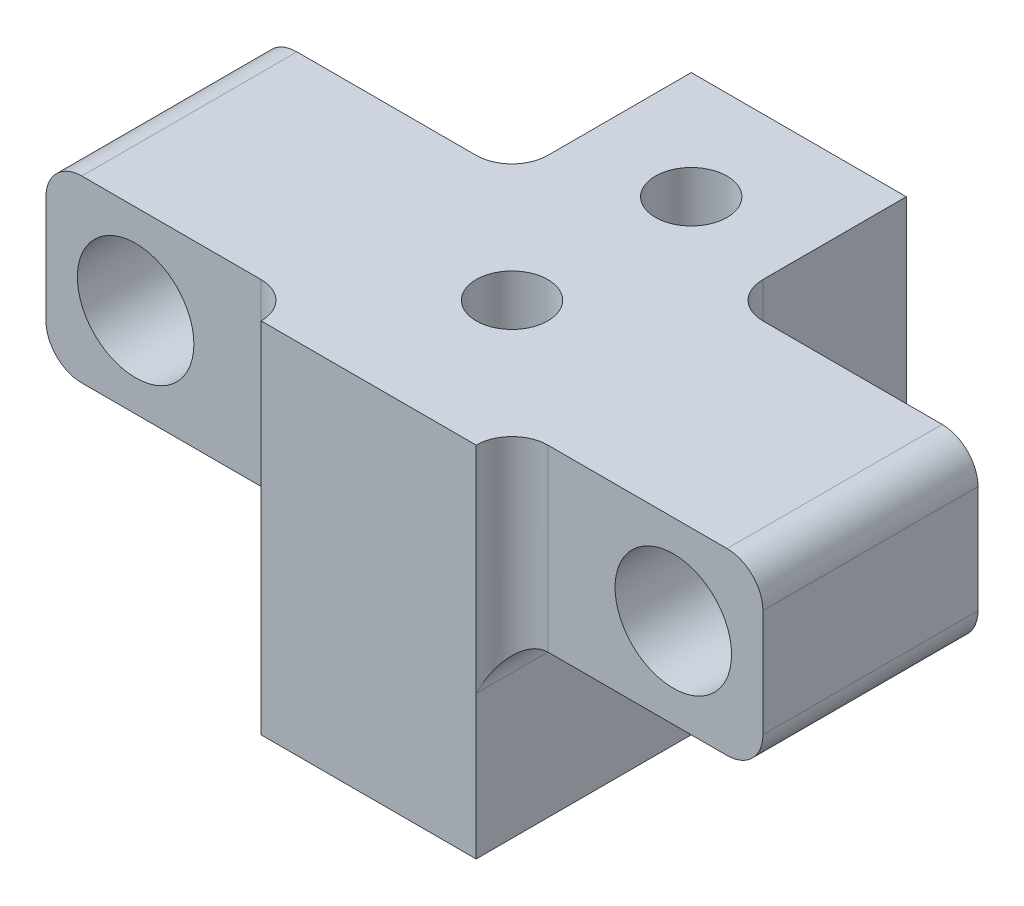
ISO-10303-21;
HEADER;
FILE_DESCRIPTION(('STEP AP214'),'2;1');
FILE_NAME('part.step','',(''),(''),'','','');
FILE_SCHEMA(('AUTOMOTIVE_DESIGN { 1 0 10303 214 1 1 1 1 }'));
ENDSEC;
DATA;
#1=APPLICATION_CONTEXT('core data for automotive mechanical design processes');
#2=APPLICATION_PROTOCOL_DEFINITION('international standard','automotive_design',2000,#1);
#3=PRODUCT_CONTEXT('',#1,'mechanical');
#4=PRODUCT('Part','Part','',(#3));
#5=PRODUCT_RELATED_PRODUCT_CATEGORY('part','',(#4));
#6=PRODUCT_DEFINITION_FORMATION('','',#4);
#7=PRODUCT_DEFINITION_CONTEXT('part definition',#1,'design');
#8=PRODUCT_DEFINITION('design','',#6,#7);
#9=PRODUCT_DEFINITION_SHAPE('','',#8);
#10=(LENGTH_UNIT() NAMED_UNIT(*) SI_UNIT(.MILLI.,.METRE.));
#11=(NAMED_UNIT(*) PLANE_ANGLE_UNIT() SI_UNIT($,.RADIAN.));
#12=(NAMED_UNIT(*) SI_UNIT($,.STERADIAN.) SOLID_ANGLE_UNIT());
#13=UNCERTAINTY_MEASURE_WITH_UNIT(LENGTH_MEASURE(1.E-05),#10,'distance_accuracy_value','');
#14=(GEOMETRIC_REPRESENTATION_CONTEXT(3) GLOBAL_UNCERTAINTY_ASSIGNED_CONTEXT((#13)) GLOBAL_UNIT_ASSIGNED_CONTEXT((#10,
#11,#12)) REPRESENTATION_CONTEXT('',''));
#15=CARTESIAN_POINT('',(0.,0.,0.));
#16=DIRECTION('',(0.,0.,1.));
#17=DIRECTION('',(1.,0.,0.));
#18=AXIS2_PLACEMENT_3D('',#15,#16,#17);
#19=CARTESIAN_POINT('',(-10.0000000000035,10.,0.));
#20=DIRECTION('',(-1.,0.,0.));
#21=DIRECTION('',(0.,0.,1.));
#22=AXIS2_PLACEMENT_3D('',#19,#20,#21);
#23=PLANE('',#22);
#24=DIRECTION('',(0.,-1.,0.));
#25=VECTOR('',#24,1.);
#26=CARTESIAN_POINT('',(-10.0000000000035,10.,-0.999999999999998));
#27=LINE('',#26,#25);
#28=CARTESIAN_POINT('',(-10.0000000000035,9.,-0.999999999999998));
#29=VERTEX_POINT('',#28);
#30=CARTESIAN_POINT('',(-10.0000000000035,5.99999999999982,-0.999999999999998));
#31=VERTEX_POINT('',#30);
#32=EDGE_CURVE('E253',#29,#31,#27,.T.);
#33=ORIENTED_EDGE('',*,*,#32,.T.);
#34=DIRECTION('',(0.,0.,1.));
#35=VECTOR('',#34,1.);
#36=CARTESIAN_POINT('',(-10.0000000000035,5.99999999999982,5.));
#37=LINE('',#36,#35);
#38=CARTESIAN_POINT('',(-10.0000000000035,5.99999999999982,5.));
#39=VERTEX_POINT('',#38);
#40=EDGE_CURVE('E320',#31,#39,#37,.T.);
#41=ORIENTED_EDGE('',*,*,#40,.T.);
#42=DIRECTION('',(0.,-1.,0.));
#43=VECTOR('',#42,1.);
#44=CARTESIAN_POINT('',(-10.0000000000035,10.,5.));
#45=LINE('',#44,#43);
#46=CARTESIAN_POINT('',(-10.0000000000035,9.,5.));
#47=VERTEX_POINT('',#46);
#48=EDGE_CURVE('E193',#47,#39,#45,.T.);
#49=ORIENTED_EDGE('',*,*,#48,.F.);
#50=DIRECTION('',(0.,0.,-1.));
#51=VECTOR('',#50,1.);
#52=CARTESIAN_POINT('',(-10.0000000000035,9.,0.));
#53=LINE('',#52,#51);
#54=EDGE_CURVE('E317',#47,#29,#53,.T.);
#55=ORIENTED_EDGE('',*,*,#54,.T.);
#56=EDGE_LOOP('',(#33,#41,#49,#55));
#57=FACE_BOUND('',#56,.T.);
#58=ADVANCED_FACE('F37',(#57),#23,.T.);
#59=CARTESIAN_POINT('',(0.,10.,5.));
#60=DIRECTION('',(0.,0.,1.));
#61=DIRECTION('',(1.,0.,0.));
#62=AXIS2_PLACEMENT_3D('',#59,#60,#61);
#63=PLANE('',#62);
#64=ORIENTED_EDGE('',*,*,#48,.T.);
#65=CARTESIAN_POINT('',(-9.00000000000349,5.99999999999982,5.));
#66=DIRECTION('',(0.,0.,1.));
#67=DIRECTION('',(1.,0.,0.));
#68=AXIS2_PLACEMENT_3D('',#65,#66,#67);
#69=CIRCLE('',#68,1.);
#70=CARTESIAN_POINT('',(-9.00000000000349,4.99999999999982,5.));
#71=VERTEX_POINT('',#70);
#72=EDGE_CURVE('E327',#39,#71,#69,.T.);
#73=ORIENTED_EDGE('',*,*,#72,.T.);
#74=DIRECTION('',(-1.,0.,0.));
#75=VECTOR('',#74,1.);
#76=CARTESIAN_POINT('',(0.,4.99999999999982,5.));
#77=LINE('',#76,#75);
#78=CARTESIAN_POINT('',(-4.,4.99999999999982,5.));
#79=VERTEX_POINT('',#78);
#80=EDGE_CURVE('E198',#79,#71,#77,.T.);
#81=ORIENTED_EDGE('',*,*,#80,.F.);
#82=DIRECTION('',(0.,-1.,0.));
#83=VECTOR('',#82,1.);
#84=CARTESIAN_POINT('',(-4.,10.,5.));
#85=LINE('',#84,#83);
#86=CARTESIAN_POINT('',(-4.,10.,5.));
#87=VERTEX_POINT('',#86);
#88=EDGE_CURVE('E323',#79,#87,#85,.F.);
#89=ORIENTED_EDGE('',*,*,#88,.T.);
#90=DIRECTION('',(-1.,0.,0.));
#91=VECTOR('',#90,1.);
#92=CARTESIAN_POINT('',(0.,10.,5.));
#93=LINE('',#92,#91);
#94=CARTESIAN_POINT('',(-9.00000000000349,10.,5.));
#95=VERTEX_POINT('',#94);
#96=EDGE_CURVE('E232',#87,#95,#93,.T.);
#97=ORIENTED_EDGE('',*,*,#96,.T.);
#98=CARTESIAN_POINT('',(-9.00000000000349,9.,5.));
#99=DIRECTION('',(0.,0.,1.));
#100=DIRECTION('',(1.,0.,0.));
#101=AXIS2_PLACEMENT_3D('',#98,#99,#100);
#102=CIRCLE('',#101,1.);
#103=EDGE_CURVE('E325',#95,#47,#102,.T.);
#104=ORIENTED_EDGE('',*,*,#103,.T.);
#105=EDGE_LOOP('',(#64,#73,#81,#89,#97,#104));
#106=FACE_BOUND('',#105,.T.);
#107=CARTESIAN_POINT('',(-7.5,7.49999999999973,5.));
#108=DIRECTION('',(0.,0.,1.));
#109=DIRECTION('',(1.,0.,0.));
#110=AXIS2_PLACEMENT_3D('',#107,#108,#109);
#111=CIRCLE('',#110,1.625);
#112=CARTESIAN_POINT('',(-5.875,7.49999999999973,5.));
#113=VERTEX_POINT('',#112);
#114=EDGE_CURVE('E216',#113,#113,#111,.T.);
#115=ORIENTED_EDGE('',*,*,#114,.F.);
#116=EDGE_LOOP('',(#115));
#117=FACE_BOUND('',#116,.T.);
#118=ADVANCED_FACE('F400',(#106,#117),#63,.T.);
#119=CARTESIAN_POINT('',(0.,10.,6.));
#120=DIRECTION('',(0.,0.,1.));
#121=DIRECTION('',(1.,0.,0.));
#122=AXIS2_PLACEMENT_3D('',#119,#120,#121);
#123=PLANE('',#122);
#124=DIRECTION('',(-1.,0.,0.));
#125=VECTOR('',#124,1.);
#126=CARTESIAN_POINT('',(0.,0.,6.));
#127=LINE('',#126,#125);
#128=CARTESIAN_POINT('',(3.,0.,6.));
#129=VERTEX_POINT('',#128);
#130=CARTESIAN_POINT('',(-3.,0.,6.));
#131=VERTEX_POINT('',#130);
#132=EDGE_CURVE('E229',#129,#131,#127,.T.);
#133=ORIENTED_EDGE('',*,*,#132,.F.);
#134=DIRECTION('',(0.,-1.,0.));
#135=VECTOR('',#134,1.);
#136=CARTESIAN_POINT('',(3.,10.,6.));
#137=LINE('',#136,#135);
#138=CARTESIAN_POINT('',(3.,3.99999999999982,6.));
#139=VERTEX_POINT('',#138);
#140=EDGE_CURVE('E276',#139,#129,#137,.T.);
#141=ORIENTED_EDGE('',*,*,#140,.F.);
#142=CARTESIAN_POINT('',(3.,10.,6.));
#143=VERTEX_POINT('',#142);
#144=EDGE_CURVE('E277',#143,#139,#137,.T.);
#145=ORIENTED_EDGE('',*,*,#144,.F.);
#146=DIRECTION('',(-1.,0.,0.));
#147=VECTOR('',#146,1.);
#148=CARTESIAN_POINT('',(0.,10.,6.));
#149=LINE('',#148,#147);
#150=CARTESIAN_POINT('',(-3.,10.,6.));
#151=VERTEX_POINT('',#150);
#152=EDGE_CURVE('E235',#143,#151,#149,.T.);
#153=ORIENTED_EDGE('',*,*,#152,.T.);
#154=DIRECTION('',(0.,-1.,0.));
#155=VECTOR('',#154,1.);
#156=CARTESIAN_POINT('',(-3.,10.,6.));
#157=LINE('',#156,#155);
#158=CARTESIAN_POINT('',(-3.,3.99999999999982,6.));
#159=VERTEX_POINT('',#158);
#160=EDGE_CURVE('E281',#151,#159,#157,.T.);
#161=ORIENTED_EDGE('',*,*,#160,.T.);
#162=EDGE_CURVE('E280',#159,#131,#157,.T.);
#163=ORIENTED_EDGE('',*,*,#162,.T.);
#164=EDGE_LOOP('',(#133,#141,#145,#153,#161,#163));
#165=FACE_BOUND('',#164,.T.);
#166=ADVANCED_FACE('F379',(#165),#123,.T.);
#167=CARTESIAN_POINT('',(0.,10.,5.));
#168=DIRECTION('',(0.,0.,1.));
#169=DIRECTION('',(1.,0.,0.));
#170=AXIS2_PLACEMENT_3D('',#167,#168,#169);
#171=PLANE('',#170);
#172=DIRECTION('',(-1.,0.,0.));
#173=VECTOR('',#172,1.);
#174=CARTESIAN_POINT('',(0.,4.99999999999982,5.));
#175=LINE('',#174,#173);
#176=CARTESIAN_POINT('',(8.99999999999651,4.99999999999982,5.));
#177=VERTEX_POINT('',#176);
#178=CARTESIAN_POINT('',(3.99999999999996,4.99999999999982,4.99999999999999));
#179=VERTEX_POINT('',#178);
#180=EDGE_CURVE('E212',#177,#179,#175,.T.);
#181=ORIENTED_EDGE('',*,*,#180,.F.);
#182=CARTESIAN_POINT('',(8.99999999999651,5.99999999999982,5.));
#183=DIRECTION('',(0.,0.,1.));
#184=DIRECTION('',(1.,0.,0.));
#185=AXIS2_PLACEMENT_3D('',#182,#183,#184);
#186=CIRCLE('',#185,1.);
#187=CARTESIAN_POINT('',(9.99999999999651,5.99999999999982,5.));
#188=VERTEX_POINT('',#187);
#189=EDGE_CURVE('E300',#177,#188,#186,.T.);
#190=ORIENTED_EDGE('',*,*,#189,.T.);
#191=DIRECTION('',(0.,-1.,0.));
#192=VECTOR('',#191,1.);
#193=CARTESIAN_POINT('',(9.99999999999651,10.,5.));
#194=LINE('',#193,#192);
#195=CARTESIAN_POINT('',(9.99999999999651,9.,5.));
#196=VERTEX_POINT('',#195);
#197=EDGE_CURVE('E273',#196,#188,#194,.T.);
#198=ORIENTED_EDGE('',*,*,#197,.F.);
#199=CARTESIAN_POINT('',(8.99999999999651,9.,5.));
#200=DIRECTION('',(0.,0.,1.));
#201=DIRECTION('',(1.,0.,0.));
#202=AXIS2_PLACEMENT_3D('',#199,#200,#201);
#203=CIRCLE('',#202,1.);
#204=CARTESIAN_POINT('',(8.99999999999651,10.,5.));
#205=VERTEX_POINT('',#204);
#206=EDGE_CURVE('E298',#196,#205,#203,.T.);
#207=ORIENTED_EDGE('',*,*,#206,.T.);
#208=DIRECTION('',(-1.,0.,0.));
#209=VECTOR('',#208,1.);
#210=CARTESIAN_POINT('',(0.,10.,5.));
#211=LINE('',#210,#209);
#212=CARTESIAN_POINT('',(4.,10.,5.));
#213=VERTEX_POINT('',#212);
#214=EDGE_CURVE('E239',#205,#213,#211,.T.);
#215=ORIENTED_EDGE('',*,*,#214,.T.);
#216=DIRECTION('',(0.,-1.,0.));
#217=VECTOR('',#216,1.);
#218=CARTESIAN_POINT('',(4.,10.,5.));
#219=LINE('',#218,#217);
#220=EDGE_CURVE('E295',#213,#179,#219,.T.);
#221=ORIENTED_EDGE('',*,*,#220,.T.);
#222=EDGE_LOOP('',(#181,#190,#198,#207,#215,#221));
#223=FACE_BOUND('',#222,.T.);
#224=CARTESIAN_POINT('',(7.49999999999995,7.49999999999973,5.));
#225=DIRECTION('',(0.,0.,1.));
#226=DIRECTION('',(1.,0.,0.));
#227=AXIS2_PLACEMENT_3D('',#224,#225,#226);
#228=CIRCLE('',#227,1.625);
#229=CARTESIAN_POINT('',(9.12499999999995,7.49999999999973,5.));
#230=VERTEX_POINT('',#229);
#231=EDGE_CURVE('E209',#230,#230,#228,.T.);
#232=ORIENTED_EDGE('',*,*,#231,.F.);
#233=EDGE_LOOP('',(#232));
#234=FACE_BOUND('',#233,.T.);
#235=ADVANCED_FACE('F369',(#223,#234),#171,.T.);
#236=CARTESIAN_POINT('',(9.99999999999651,10.,0.));
#237=DIRECTION('',(-1.,0.,0.));
#238=DIRECTION('',(0.,0.,1.));
#239=AXIS2_PLACEMENT_3D('',#236,#237,#238);
#240=PLANE('',#239);
#241=ORIENTED_EDGE('',*,*,#197,.T.);
#242=DIRECTION('',(0.,0.,1.));
#243=VECTOR('',#242,1.);
#244=CARTESIAN_POINT('',(9.99999999999651,5.99999999999982,0.));
#245=LINE('',#244,#243);
#246=CARTESIAN_POINT('',(9.99999999999651,5.99999999999982,-1.));
#247=VERTEX_POINT('',#246);
#248=EDGE_CURVE('E304',#188,#247,#245,.F.);
#249=ORIENTED_EDGE('',*,*,#248,.T.);
#250=DIRECTION('',(0.,-1.,0.));
#251=VECTOR('',#250,1.);
#252=CARTESIAN_POINT('',(9.99999999999651,10.,-1.));
#253=LINE('',#252,#251);
#254=CARTESIAN_POINT('',(9.99999999999651,9.,-1.));
#255=VERTEX_POINT('',#254);
#256=EDGE_CURVE('E270',#255,#247,#253,.T.);
#257=ORIENTED_EDGE('',*,*,#256,.F.);
#258=DIRECTION('',(0.,0.,-1.));
#259=VECTOR('',#258,1.);
#260=CARTESIAN_POINT('',(9.99999999999651,9.,5.));
#261=LINE('',#260,#259);
#262=EDGE_CURVE('E302',#255,#196,#261,.F.);
#263=ORIENTED_EDGE('',*,*,#262,.T.);
#264=EDGE_LOOP('',(#241,#249,#257,#263));
#265=FACE_BOUND('',#264,.T.);
#266=ADVANCED_FACE('F443',(#265),#240,.F.);
#267=CARTESIAN_POINT('',(0.,10.,-1.));
#268=DIRECTION('',(0.,0.,1.));
#269=DIRECTION('',(1.,0.,0.));
#270=AXIS2_PLACEMENT_3D('',#267,#268,#269);
#271=PLANE('',#270);
#272=CARTESIAN_POINT('',(7.49999999999995,7.49999999999973,-1.));
#273=DIRECTION('',(0.,0.,1.));
#274=DIRECTION('',(1.,0.,0.));
#275=AXIS2_PLACEMENT_3D('',#272,#273,#274);
#276=CIRCLE('',#275,1.625);
#277=CARTESIAN_POINT('',(9.12499999999995,7.49999999999973,-1.));
#278=VERTEX_POINT('',#277);
#279=EDGE_CURVE('E201',#278,#278,#276,.T.);
#280=ORIENTED_EDGE('',*,*,#279,.T.);
#281=EDGE_LOOP('',(#280));
#282=FACE_BOUND('',#281,.T.);
#283=ORIENTED_EDGE('',*,*,#256,.T.);
#284=CARTESIAN_POINT('',(8.99999999999651,5.99999999999982,-1.));
#285=DIRECTION('',(0.,0.,1.));
#286=DIRECTION('',(1.,0.,0.));
#287=AXIS2_PLACEMENT_3D('',#284,#285,#286);
#288=CIRCLE('',#287,1.);
#289=CARTESIAN_POINT('',(8.99999999999651,4.99999999999982,-1.));
#290=VERTEX_POINT('',#289);
#291=EDGE_CURVE('E310',#247,#290,#288,.F.);
#292=ORIENTED_EDGE('',*,*,#291,.T.);
#293=DIRECTION('',(-1.,0.,0.));
#294=VECTOR('',#293,1.);
#295=CARTESIAN_POINT('',(0.,4.99999999999982,-1.));
#296=LINE('',#295,#294);
#297=CARTESIAN_POINT('',(3.99999999999996,4.99999999999982,-1.));
#298=VERTEX_POINT('',#297);
#299=EDGE_CURVE('E192',#290,#298,#296,.T.);
#300=ORIENTED_EDGE('',*,*,#299,.T.);
#301=DIRECTION('',(0.,-1.,0.));
#302=VECTOR('',#301,1.);
#303=CARTESIAN_POINT('',(4.,10.,-1.));
#304=LINE('',#303,#302);
#305=CARTESIAN_POINT('',(4.,10.,-1.));
#306=VERTEX_POINT('',#305);
#307=EDGE_CURVE('E306',#298,#306,#304,.F.);
#308=ORIENTED_EDGE('',*,*,#307,.T.);
#309=DIRECTION('',(-1.,0.,0.));
#310=VECTOR('',#309,1.);
#311=CARTESIAN_POINT('',(0.,10.,-1.));
#312=LINE('',#311,#310);
#313=CARTESIAN_POINT('',(8.99999999999651,10.,-1.));
#314=VERTEX_POINT('',#313);
#315=EDGE_CURVE('E242',#314,#306,#312,.T.);
#316=ORIENTED_EDGE('',*,*,#315,.F.);
#317=CARTESIAN_POINT('',(8.99999999999651,9.,-1.));
#318=DIRECTION('',(0.,0.,1.));
#319=DIRECTION('',(1.,0.,0.));
#320=AXIS2_PLACEMENT_3D('',#317,#318,#319);
#321=CIRCLE('',#320,1.);
#322=EDGE_CURVE('E308',#314,#255,#321,.F.);
#323=ORIENTED_EDGE('',*,*,#322,.T.);
#324=EDGE_LOOP('',(#283,#292,#300,#308,#316,#323));
#325=FACE_BOUND('',#324,.T.);
#326=ADVANCED_FACE('F362',(#282,#325),#271,.F.);
#327=CARTESIAN_POINT('',(3.,10.,0.));
#328=DIRECTION('',(-1.,0.,0.));
#329=DIRECTION('',(0.,0.,1.));
#330=AXIS2_PLACEMENT_3D('',#327,#328,#329);
#331=PLANE('',#330);
#332=DIRECTION('',(0.,0.,1.));
#333=VECTOR('',#332,1.);
#334=CARTESIAN_POINT('',(2.99999999999997,3.99999999999982,-6.));
#335=LINE('',#334,#333);
#336=CARTESIAN_POINT('',(2.99999999999997,3.99999999999982,-2.));
#337=VERTEX_POINT('',#336);
#338=EDGE_CURVE('E52',#337,#139,#335,.T.);
#339=ORIENTED_EDGE('',*,*,#338,.T.);
#340=ORIENTED_EDGE('',*,*,#140,.T.);
#341=DIRECTION('',(0.,0.,-1.));
#342=VECTOR('',#341,1.);
#343=CARTESIAN_POINT('',(3.,0.,0.));
#344=LINE('',#343,#342);
#345=CARTESIAN_POINT('',(3.,0.,-6.));
#346=VERTEX_POINT('',#345);
#347=EDGE_CURVE('E256',#129,#346,#344,.T.);
#348=ORIENTED_EDGE('',*,*,#347,.T.);
#349=DIRECTION('',(0.,-1.,0.));
#350=VECTOR('',#349,1.);
#351=CARTESIAN_POINT('',(3.,10.,-6.));
#352=LINE('',#351,#350);
#353=CARTESIAN_POINT('',(3.,10.,-6.));
#354=VERTEX_POINT('',#353);
#355=EDGE_CURVE('E268',#354,#346,#352,.T.);
#356=ORIENTED_EDGE('',*,*,#355,.F.);
#357=DIRECTION('',(0.,0.,-1.));
#358=VECTOR('',#357,1.);
#359=CARTESIAN_POINT('',(3.,10.,0.));
#360=LINE('',#359,#358);
#361=CARTESIAN_POINT('',(3.,10.,-2.));
#362=VERTEX_POINT('',#361);
#363=EDGE_CURVE('E245',#362,#354,#360,.T.);
#364=ORIENTED_EDGE('',*,*,#363,.F.);
#365=DIRECTION('',(0.,-1.,0.));
#366=VECTOR('',#365,1.);
#367=CARTESIAN_POINT('',(3.,3.99999999999982,-2.));
#368=LINE('',#367,#366);
#369=EDGE_CURVE('E334',#362,#337,#368,.T.);
#370=ORIENTED_EDGE('',*,*,#369,.T.);
#371=EDGE_LOOP('',(#339,#340,#348,#356,#364,#370));
#372=FACE_BOUND('',#371,.T.);
#373=ADVANCED_FACE('F355',(#372),#331,.F.);
#374=CARTESIAN_POINT('',(0.,10.,-6.));
#375=DIRECTION('',(0.,0.,1.));
#376=DIRECTION('',(1.,0.,0.));
#377=AXIS2_PLACEMENT_3D('',#374,#375,#376);
#378=PLANE('',#377);
#379=DIRECTION('',(-1.,0.,0.));
#380=VECTOR('',#379,1.);
#381=CARTESIAN_POINT('',(0.,0.,-6.));
#382=LINE('',#381,#380);
#383=CARTESIAN_POINT('',(-3.,0.,-6.));
#384=VERTEX_POINT('',#383);
#385=EDGE_CURVE('E259',#346,#384,#382,.T.);
#386=ORIENTED_EDGE('',*,*,#385,.T.);
#387=DIRECTION('',(0.,-1.,0.));
#388=VECTOR('',#387,1.);
#389=CARTESIAN_POINT('',(-3.,10.,-6.));
#390=LINE('',#389,#388);
#391=CARTESIAN_POINT('',(-3.,10.,-6.));
#392=VERTEX_POINT('',#391);
#393=EDGE_CURVE('E266',#392,#384,#390,.T.);
#394=ORIENTED_EDGE('',*,*,#393,.F.);
#395=DIRECTION('',(-1.,0.,0.));
#396=VECTOR('',#395,1.);
#397=CARTESIAN_POINT('',(0.,10.,-6.));
#398=LINE('',#397,#396);
#399=EDGE_CURVE('E247',#354,#392,#398,.T.);
#400=ORIENTED_EDGE('',*,*,#399,.F.);
#401=ORIENTED_EDGE('',*,*,#355,.T.);
#402=EDGE_LOOP('',(#386,#394,#400,#401));
#403=FACE_BOUND('',#402,.T.);
#404=ADVANCED_FACE('F388',(#403),#378,.F.);
#405=CARTESIAN_POINT('',(-3.,10.,0.));
#406=DIRECTION('',(-1.,0.,0.));
#407=DIRECTION('',(0.,0.,1.));
#408=AXIS2_PLACEMENT_3D('',#405,#406,#407);
#409=PLANE('',#408);
#410=ORIENTED_EDGE('',*,*,#162,.F.);
#411=DIRECTION('',(0.,0.,1.));
#412=VECTOR('',#411,1.);
#413=CARTESIAN_POINT('',(-3.,3.99999999999982,-6.));
#414=LINE('',#413,#412);
#415=CARTESIAN_POINT('',(-3.,3.99999999999982,-2.));
#416=VERTEX_POINT('',#415);
#417=EDGE_CURVE('E199',#416,#159,#414,.T.);
#418=ORIENTED_EDGE('',*,*,#417,.F.);
#419=DIRECTION('',(0.,-1.,0.));
#420=VECTOR('',#419,1.);
#421=CARTESIAN_POINT('',(-3.,10.,-2.));
#422=LINE('',#421,#420);
#423=CARTESIAN_POINT('',(-3.,10.,-2.));
#424=VERTEX_POINT('',#423);
#425=EDGE_CURVE('E169',#416,#424,#422,.F.);
#426=ORIENTED_EDGE('',*,*,#425,.T.);
#427=DIRECTION('',(0.,0.,-1.));
#428=VECTOR('',#427,1.);
#429=CARTESIAN_POINT('',(-3.,10.,0.));
#430=LINE('',#429,#428);
#431=EDGE_CURVE('E250',#424,#392,#430,.T.);
#432=ORIENTED_EDGE('',*,*,#431,.T.);
#433=ORIENTED_EDGE('',*,*,#393,.T.);
#434=DIRECTION('',(0.,0.,-1.));
#435=VECTOR('',#434,1.);
#436=CARTESIAN_POINT('',(-3.,0.,0.));
#437=LINE('',#436,#435);
#438=EDGE_CURVE('E236',#131,#384,#437,.T.);
#439=ORIENTED_EDGE('',*,*,#438,.F.);
#440=EDGE_LOOP('',(#410,#418,#426,#432,#433,#439));
#441=FACE_BOUND('',#440,.T.);
#442=ADVANCED_FACE('F392',(#441),#409,.T.);
#443=CARTESIAN_POINT('',(0.,10.,-1.));
#444=DIRECTION('',(0.,0.,1.));
#445=DIRECTION('',(1.,0.,0.));
#446=AXIS2_PLACEMENT_3D('',#443,#444,#445);
#447=PLANE('',#446);
#448=CARTESIAN_POINT('',(-7.5,7.49999999999973,-0.999999999999998));
#449=DIRECTION('',(0.,0.,1.));
#450=DIRECTION('',(1.,0.,0.));
#451=AXIS2_PLACEMENT_3D('',#448,#449,#450);
#452=CIRCLE('',#451,1.625);
#453=CARTESIAN_POINT('',(-5.875,7.49999999999973,-0.999999999999999));
#454=VERTEX_POINT('',#453);
#455=EDGE_CURVE('E215',#454,#454,#452,.T.);
#456=ORIENTED_EDGE('',*,*,#455,.T.);
#457=EDGE_LOOP('',(#456));
#458=FACE_BOUND('',#457,.T.);
#459=DIRECTION('',(-1.,0.,0.));
#460=VECTOR('',#459,1.);
#461=CARTESIAN_POINT('',(0.,4.99999999999982,-1.));
#462=LINE('',#461,#460);
#463=CARTESIAN_POINT('',(-4.,4.99999999999982,-1.));
#464=VERTEX_POINT('',#463);
#465=CARTESIAN_POINT('',(-9.00000000000349,4.99999999999982,-0.999999999999999));
#466=VERTEX_POINT('',#465);
#467=EDGE_CURVE('E178',#464,#466,#462,.T.);
#468=ORIENTED_EDGE('',*,*,#467,.T.);
#469=CARTESIAN_POINT('',(-9.00000000000349,5.99999999999982,-0.999999999999999));
#470=DIRECTION('',(0.,0.,1.));
#471=DIRECTION('',(1.,0.,0.));
#472=AXIS2_PLACEMENT_3D('',#469,#470,#471);
#473=CIRCLE('',#472,1.);
#474=EDGE_CURVE('E331',#466,#31,#473,.F.);
#475=ORIENTED_EDGE('',*,*,#474,.T.);
#476=ORIENTED_EDGE('',*,*,#32,.F.);
#477=CARTESIAN_POINT('',(-9.00000000000349,9.,-0.999999999999999));
#478=DIRECTION('',(0.,0.,1.));
#479=DIRECTION('',(1.,0.,0.));
#480=AXIS2_PLACEMENT_3D('',#477,#478,#479);
#481=CIRCLE('',#480,1.);
#482=CARTESIAN_POINT('',(-9.00000000000349,10.,-0.999999999999999));
#483=VERTEX_POINT('',#482);
#484=EDGE_CURVE('E182',#29,#483,#481,.F.);
#485=ORIENTED_EDGE('',*,*,#484,.T.);
#486=DIRECTION('',(-1.,0.,0.));
#487=VECTOR('',#486,1.);
#488=CARTESIAN_POINT('',(0.,10.,-1.));
#489=LINE('',#488,#487);
#490=CARTESIAN_POINT('',(-4.,10.,-0.999999999999999));
#491=VERTEX_POINT('',#490);
#492=EDGE_CURVE('E181',#491,#483,#489,.T.);
#493=ORIENTED_EDGE('',*,*,#492,.F.);
#494=DIRECTION('',(0.,-1.,0.));
#495=VECTOR('',#494,1.);
#496=CARTESIAN_POINT('',(-4.,10.,-0.999999999999999));
#497=LINE('',#496,#495);
#498=EDGE_CURVE('E168',#491,#464,#497,.T.);
#499=ORIENTED_EDGE('',*,*,#498,.T.);
#500=EDGE_LOOP('',(#468,#475,#476,#485,#493,#499));
#501=FACE_BOUND('',#500,.T.);
#502=ADVANCED_FACE('F177',(#458,#501),#447,.F.);
#503=CARTESIAN_POINT('',(0.,10.,0.));
#504=DIRECTION('',(0.,1.,0.));
#505=DIRECTION('',(0.,0.,1.));
#506=AXIS2_PLACEMENT_3D('',#503,#504,#505);
#507=PLANE('',#506);
#508=CARTESIAN_POINT('',(0.,10.,2.));
#509=DIRECTION('',(0.,1.,0.));
#510=DIRECTION('',(0.,0.,1.));
#511=AXIS2_PLACEMENT_3D('',#508,#509,#510);
#512=CIRCLE('',#511,1.);
#513=CARTESIAN_POINT('',(0.,10.,3.));
#514=VERTEX_POINT('',#513);
#515=EDGE_CURVE('E220',#514,#514,#512,.T.);
#516=ORIENTED_EDGE('',*,*,#515,.F.);
#517=EDGE_LOOP('',(#516));
#518=FACE_BOUND('',#517,.T.);
#519=CARTESIAN_POINT('',(0.,10.,-2.99999999999989));
#520=DIRECTION('',(0.,1.,0.));
#521=DIRECTION('',(0.,0.,1.));
#522=AXIS2_PLACEMENT_3D('',#519,#520,#521);
#523=CIRCLE('',#522,1.);
#524=CARTESIAN_POINT('',(0.,10.,-1.99999999999989));
#525=VERTEX_POINT('',#524);
#526=EDGE_CURVE('E226',#525,#525,#523,.T.);
#527=ORIENTED_EDGE('',*,*,#526,.F.);
#528=EDGE_LOOP('',(#527));
#529=FACE_BOUND('',#528,.T.);
#530=ORIENTED_EDGE('',*,*,#214,.F.);
#531=DIRECTION('',(0.,0.,-1.));
#532=VECTOR('',#531,1.);
#533=CARTESIAN_POINT('',(8.99999999999651,10.,-1.));
#534=LINE('',#533,#532);
#535=EDGE_CURVE('E314',#205,#314,#534,.T.);
#536=ORIENTED_EDGE('',*,*,#535,.T.);
#537=ORIENTED_EDGE('',*,*,#315,.T.);
#538=CARTESIAN_POINT('',(4.,10.,-2.));
#539=DIRECTION('',(0.,1.,0.));
#540=DIRECTION('',(0.,0.,1.));
#541=AXIS2_PLACEMENT_3D('',#538,#539,#540);
#542=CIRCLE('',#541,1.);
#543=EDGE_CURVE('E172',#306,#362,#542,.F.);
#544=ORIENTED_EDGE('',*,*,#543,.T.);
#545=ORIENTED_EDGE('',*,*,#363,.T.);
#546=ORIENTED_EDGE('',*,*,#399,.T.);
#547=ORIENTED_EDGE('',*,*,#431,.F.);
#548=CARTESIAN_POINT('',(-4.,10.,-2.));
#549=DIRECTION('',(0.,1.,0.));
#550=DIRECTION('',(0.,0.,1.));
#551=AXIS2_PLACEMENT_3D('',#548,#549,#550);
#552=CIRCLE('',#551,1.);
#553=EDGE_CURVE('E11',#424,#491,#552,.F.);
#554=ORIENTED_EDGE('',*,*,#553,.T.);
#555=ORIENTED_EDGE('',*,*,#492,.T.);
#556=DIRECTION('',(0.,0.,-1.));
#557=VECTOR('',#556,1.);
#558=CARTESIAN_POINT('',(-9.00000000000349,10.,0.));
#559=LINE('',#558,#557);
#560=EDGE_CURVE('E312',#483,#95,#559,.F.);
#561=ORIENTED_EDGE('',*,*,#560,.T.);
#562=ORIENTED_EDGE('',*,*,#96,.F.);
#563=CARTESIAN_POINT('',(-4.,10.,6.));
#564=DIRECTION('',(0.,1.,0.));
#565=DIRECTION('',(0.,0.,1.));
#566=AXIS2_PLACEMENT_3D('',#563,#564,#565);
#567=CIRCLE('',#566,1.);
#568=EDGE_CURVE('E337',#87,#151,#567,.F.);
#569=ORIENTED_EDGE('',*,*,#568,.T.);
#570=ORIENTED_EDGE('',*,*,#152,.F.);
#571=CARTESIAN_POINT('',(4.,10.,6.));
#572=DIRECTION('',(0.,1.,0.));
#573=DIRECTION('',(0.,0.,1.));
#574=AXIS2_PLACEMENT_3D('',#571,#572,#573);
#575=CIRCLE('',#574,1.);
#576=EDGE_CURVE('E341',#143,#213,#575,.F.);
#577=ORIENTED_EDGE('',*,*,#576,.T.);
#578=EDGE_LOOP('',(#530,#536,#537,#544,#545,#546,#547,#554,#555,#561,#562,#569,#570,#577));
#579=FACE_BOUND('',#578,.T.);
#580=ADVANCED_FACE('F349',(#518,#529,#579),#507,.T.);
#581=CARTESIAN_POINT('',(0.,0.,0.));
#582=DIRECTION('',(0.,1.,0.));
#583=DIRECTION('',(0.,0.,1.));
#584=AXIS2_PLACEMENT_3D('',#581,#582,#583);
#585=PLANE('',#584);
#586=CARTESIAN_POINT('',(0.,0.,2.));
#587=DIRECTION('',(0.,1.,0.));
#588=DIRECTION('',(0.,0.,1.));
#589=AXIS2_PLACEMENT_3D('',#586,#587,#588);
#590=CIRCLE('',#589,1.);
#591=CARTESIAN_POINT('',(0.,0.,3.));
#592=VERTEX_POINT('',#591);
#593=EDGE_CURVE('E219',#592,#592,#590,.T.);
#594=ORIENTED_EDGE('',*,*,#593,.T.);
#595=EDGE_LOOP('',(#594));
#596=FACE_BOUND('',#595,.T.);
#597=CARTESIAN_POINT('',(0.,0.,-2.99999999999989));
#598=DIRECTION('',(0.,1.,0.));
#599=DIRECTION('',(0.,0.,1.));
#600=AXIS2_PLACEMENT_3D('',#597,#598,#599);
#601=CIRCLE('',#600,1.);
#602=CARTESIAN_POINT('',(0.,0.,-1.99999999999989));
#603=VERTEX_POINT('',#602);
#604=EDGE_CURVE('E223',#603,#603,#601,.T.);
#605=ORIENTED_EDGE('',*,*,#604,.T.);
#606=EDGE_LOOP('',(#605));
#607=FACE_BOUND('',#606,.T.);
#608=ORIENTED_EDGE('',*,*,#132,.T.);
#609=ORIENTED_EDGE('',*,*,#438,.T.);
#610=ORIENTED_EDGE('',*,*,#385,.F.);
#611=ORIENTED_EDGE('',*,*,#347,.F.);
#612=EDGE_LOOP('',(#608,#609,#610,#611));
#613=FACE_BOUND('',#612,.T.);
#614=ADVANCED_FACE('F384',(#596,#607,#613),#585,.F.);
#615=CARTESIAN_POINT('',(0.,10.,-2.99999999999989));
#616=DIRECTION('',(0.,-1.,0.));
#617=DIRECTION('',(0.,0.,-1.));
#618=AXIS2_PLACEMENT_3D('',#615,#616,#617);
#619=CYLINDRICAL_SURFACE('',#618,1.);
#620=ORIENTED_EDGE('',*,*,#526,.T.);
#621=EDGE_LOOP('',(#620));
#622=FACE_BOUND('',#621,.T.);
#623=ORIENTED_EDGE('',*,*,#604,.F.);
#624=EDGE_LOOP('',(#623));
#625=FACE_BOUND('',#624,.T.);
#626=ADVANCED_FACE('F636',(#622,#625),#619,.F.);
#627=CARTESIAN_POINT('',(0.,10.,2.));
#628=DIRECTION('',(0.,-1.,0.));
#629=DIRECTION('',(0.,0.,-1.));
#630=AXIS2_PLACEMENT_3D('',#627,#628,#629);
#631=CYLINDRICAL_SURFACE('',#630,1.);
#632=ORIENTED_EDGE('',*,*,#515,.T.);
#633=EDGE_LOOP('',(#632));
#634=FACE_BOUND('',#633,.T.);
#635=ORIENTED_EDGE('',*,*,#593,.F.);
#636=EDGE_LOOP('',(#635));
#637=FACE_BOUND('',#636,.T.);
#638=ADVANCED_FACE('F626',(#634,#637),#631,.F.);
#639=CARTESIAN_POINT('',(-7.5,7.49999999999973,-6.));
#640=DIRECTION('',(0.,0.,1.));
#641=DIRECTION('',(1.,0.,0.));
#642=AXIS2_PLACEMENT_3D('',#639,#640,#641);
#643=CYLINDRICAL_SURFACE('',#642,1.625);
#644=CARTESIAN_POINT('',(-5.875,7.49999999999973,5.));
#645=CARTESIAN_POINT('',(-5.875,7.49999999999973,4.9375));
#646=CARTESIAN_POINT('',(-5.875,7.49999999999973,4.875));
#647=CARTESIAN_POINT('',(-5.875,7.49999999999973,4.75));
#648=CARTESIAN_POINT('',(-5.875,7.49999999999973,4.6875));
#649=CARTESIAN_POINT('',(-5.875,7.49999999999973,4.5625));
#650=CARTESIAN_POINT('',(-5.875,7.49999999999973,4.5));
#651=CARTESIAN_POINT('',(-5.875,7.49999999999973,4.375));
#652=CARTESIAN_POINT('',(-5.875,7.49999999999973,4.3125));
#653=CARTESIAN_POINT('',(-5.875,7.49999999999973,4.1875));
#654=CARTESIAN_POINT('',(-5.875,7.49999999999973,4.125));
#655=CARTESIAN_POINT('',(-5.875,7.49999999999973,4.));
#656=CARTESIAN_POINT('',(-5.875,7.49999999999973,3.9375));
#657=CARTESIAN_POINT('',(-5.875,7.49999999999973,3.8125));
#658=CARTESIAN_POINT('',(-5.875,7.49999999999973,3.75));
#659=CARTESIAN_POINT('',(-5.875,7.49999999999973,3.625));
#660=CARTESIAN_POINT('',(-5.875,7.49999999999973,3.5625));
#661=CARTESIAN_POINT('',(-5.875,7.49999999999973,3.4375));
#662=CARTESIAN_POINT('',(-5.875,7.49999999999973,3.375));
#663=CARTESIAN_POINT('',(-5.875,7.49999999999973,3.25));
#664=CARTESIAN_POINT('',(-5.875,7.49999999999973,3.1875));
#665=CARTESIAN_POINT('',(-5.875,7.49999999999973,3.0625));
#666=CARTESIAN_POINT('',(-5.875,7.49999999999973,3.));
#667=CARTESIAN_POINT('',(-5.875,7.49999999999973,2.875));
#668=CARTESIAN_POINT('',(-5.875,7.49999999999973,2.8125));
#669=CARTESIAN_POINT('',(-5.875,7.49999999999973,2.6875));
#670=CARTESIAN_POINT('',(-5.875,7.49999999999973,2.625));
#671=CARTESIAN_POINT('',(-5.875,7.49999999999973,2.5));
#672=CARTESIAN_POINT('',(-5.875,7.49999999999973,2.4375));
#673=CARTESIAN_POINT('',(-5.875,7.49999999999973,2.3125));
#674=CARTESIAN_POINT('',(-5.875,7.49999999999973,2.25));
#675=CARTESIAN_POINT('',(-5.875,7.49999999999973,2.125));
#676=CARTESIAN_POINT('',(-5.875,7.49999999999973,2.0625));
#677=CARTESIAN_POINT('',(-5.875,7.49999999999973,1.9375));
#678=CARTESIAN_POINT('',(-5.875,7.49999999999973,1.875));
#679=CARTESIAN_POINT('',(-5.875,7.49999999999973,1.75));
#680=CARTESIAN_POINT('',(-5.875,7.49999999999973,1.6875));
#681=CARTESIAN_POINT('',(-5.875,7.49999999999973,1.5625));
#682=CARTESIAN_POINT('',(-5.875,7.49999999999973,1.5));
#683=CARTESIAN_POINT('',(-5.875,7.49999999999973,1.375));
#684=CARTESIAN_POINT('',(-5.875,7.49999999999973,1.3125));
#685=CARTESIAN_POINT('',(-5.875,7.49999999999973,1.1875));
#686=CARTESIAN_POINT('',(-5.875,7.49999999999973,1.125));
#687=CARTESIAN_POINT('',(-5.875,7.49999999999973,1.));
#688=CARTESIAN_POINT('',(-5.875,7.49999999999973,0.937500000000001));
#689=CARTESIAN_POINT('',(-5.875,7.49999999999973,0.812500000000001));
#690=CARTESIAN_POINT('',(-5.875,7.49999999999973,0.750000000000001));
#691=CARTESIAN_POINT('',(-5.875,7.49999999999973,0.625000000000001));
#692=CARTESIAN_POINT('',(-5.875,7.49999999999973,0.5625));
#693=CARTESIAN_POINT('',(-5.875,7.49999999999973,0.437500000000001));
#694=CARTESIAN_POINT('',(-5.875,7.49999999999973,0.375000000000001));
#695=CARTESIAN_POINT('',(-5.875,7.49999999999973,0.250000000000001));
#696=CARTESIAN_POINT('',(-5.875,7.49999999999973,0.187500000000001));
#697=CARTESIAN_POINT('',(-5.875,7.49999999999973,0.0625000000000009));
#698=CARTESIAN_POINT('',(-5.875,7.49999999999973,0.));
#699=CARTESIAN_POINT('',(-5.875,7.49999999999973,-0.124999999999999));
#700=CARTESIAN_POINT('',(-5.875,7.49999999999973,-0.187499999999999));
#701=CARTESIAN_POINT('',(-5.875,7.49999999999973,-0.312499999999999));
#702=CARTESIAN_POINT('',(-5.875,7.49999999999973,-0.374999999999999));
#703=CARTESIAN_POINT('',(-5.875,7.49999999999973,-0.499999999999999));
#704=CARTESIAN_POINT('',(-5.875,7.49999999999973,-0.562499999999999));
#705=CARTESIAN_POINT('',(-5.875,7.49999999999973,-0.687499999999999));
#706=CARTESIAN_POINT('',(-5.875,7.49999999999973,-0.749999999999999));
#707=CARTESIAN_POINT('',(-5.875,7.49999999999973,-0.874999999999999));
#708=CARTESIAN_POINT('',(-5.875,7.49999999999973,-0.937499999999999));
#709=CARTESIAN_POINT('',(-5.875,7.49999999999973,-0.999999999999999));
#710=B_SPLINE_CURVE_WITH_KNOTS('',3,(#644,#645,#646,#647,#648,#649,#650,#651,#652,#653,#654,
#655,#656,#657,#658,#659,#660,#661,#662,#663,#664,#665,#666,#667,#668,#669,#670,#671,#672,#673,
#674,#675,#676,#677,#678,#679,#680,#681,#682,#683,#684,#685,#686,#687,#688,#689,#690,#691,#692,
#693,#694,#695,#696,#697,#698,#699,#700,#701,#702,#703,#704,#705,#706,#707,#708,#709),
.UNSPECIFIED.,.F.,.F.,(4,2,2,2,2,2,2,2,2,2,2,2,2,2,2,2,2,2,2,2,2,2,2,2,2,2,2,2,2,2,2,2,4),(0.,
0.1875,0.375,0.5625,0.750000000000001,0.937500000000001,1.125,1.3125,1.5,1.6875,1.875,2.0625,
2.25,2.4375,2.625,2.8125,3.,3.1875,3.375,3.5625,3.75,3.9375,4.125,4.3125,4.5,4.6875,4.875,
5.0625,5.25,5.4375,5.625,5.8125,6.),.UNSPECIFIED.);
#711=EDGE_CURVE('BSEAM528',#113,#454,#710,.T.);
#712=ORIENTED_EDGE('',*,*,#114,.T.);
#713=ORIENTED_EDGE('',*,*,#455,.F.);
#714=ORIENTED_EDGE('',*,*,#711,.T.);
#715=ORIENTED_EDGE('',*,*,#711,.F.);
#716=EDGE_LOOP('',(#712,#714,#713,#715));
#717=FACE_BOUND('',#716,.T.);
#718=ADVANCED_FACE('F528',(#717),#643,.F.);
#719=CARTESIAN_POINT('',(9.99999999999647,4.99999999999982,-6.));
#720=DIRECTION('',(0.,1.,0.));
#721=DIRECTION('',(0.,0.,1.));
#722=AXIS2_PLACEMENT_3D('',#719,#720,#721);
#723=PLANE('',#722);
#724=ORIENTED_EDGE('',*,*,#299,.F.);
#725=DIRECTION('',(0.,0.,1.));
#726=VECTOR('',#725,1.);
#727=CARTESIAN_POINT('',(8.99999999999651,4.99999999999982,-6.));
#728=LINE('',#727,#726);
#729=EDGE_CURVE('E292',#290,#177,#728,.T.);
#730=ORIENTED_EDGE('',*,*,#729,.T.);
#731=ORIENTED_EDGE('',*,*,#180,.T.);
#732=DIRECTION('',(0.,0.,1.));
#733=VECTOR('',#732,1.);
#734=CARTESIAN_POINT('',(3.99999999999996,4.99999999999982,-6.));
#735=LINE('',#734,#733);
#736=EDGE_CURVE('E203',#298,#179,#735,.T.);
#737=ORIENTED_EDGE('',*,*,#736,.F.);
#738=EDGE_LOOP('',(#724,#730,#731,#737));
#739=FACE_BOUND('',#738,.T.);
#740=ADVANCED_FACE('F366',(#739),#723,.F.);
#741=CARTESIAN_POINT('',(3.99999999999997,3.99999999999982,-6.));
#742=DIRECTION('',(0.,0.,1.));
#743=DIRECTION('',(1.,0.,0.));
#744=AXIS2_PLACEMENT_3D('',#741,#742,#743);
#745=CYLINDRICAL_SURFACE('',#744,0.999999999999999);
#746=ORIENTED_EDGE('',*,*,#736,.T.);
#747=CARTESIAN_POINT('',(3.99999999999999,3.99999999999982,6.));
#748=DIRECTION('',(0.,0.707106781186548,0.707106781186547));
#749=DIRECTION('',(0.,-0.707106781186548,0.707106781186547));
#750=AXIS2_PLACEMENT_3D('',#747,#748,#749);
#751=ELLIPSE('',#750,1.41421356237309,1.);
#752=EDGE_CURVE('E339',#179,#139,#751,.T.);
#753=ORIENTED_EDGE('',*,*,#752,.T.);
#754=ORIENTED_EDGE('',*,*,#338,.F.);
#755=CARTESIAN_POINT('',(3.99999999999999,3.99999999999982,-2.));
#756=DIRECTION('',(0.,-0.707106781186548,0.707106781186547));
#757=DIRECTION('',(0.,0.707106781186548,0.707106781186547));
#758=AXIS2_PLACEMENT_3D('',#755,#756,#757);
#759=ELLIPSE('',#758,1.41421356237309,1.);
#760=EDGE_CURVE('E343',#337,#298,#759,.F.);
#761=ORIENTED_EDGE('',*,*,#760,.T.);
#762=EDGE_LOOP('',(#746,#753,#754,#761));
#763=FACE_BOUND('',#762,.T.);
#764=ADVANCED_FACE('F358',(#763),#745,.F.);
#765=CARTESIAN_POINT('',(-9.99999999999651,4.99999999999982,-6.));
#766=DIRECTION('',(0.,1.,0.));
#767=DIRECTION('',(0.,0.,1.));
#768=AXIS2_PLACEMENT_3D('',#765,#766,#767);
#769=PLANE('',#768);
#770=ORIENTED_EDGE('',*,*,#80,.T.);
#771=DIRECTION('',(0.,0.,1.));
#772=VECTOR('',#771,1.);
#773=CARTESIAN_POINT('',(-9.00000000000349,4.99999999999982,-1.));
#774=LINE('',#773,#772);
#775=EDGE_CURVE('E183',#71,#466,#774,.F.);
#776=ORIENTED_EDGE('',*,*,#775,.T.);
#777=ORIENTED_EDGE('',*,*,#467,.F.);
#778=DIRECTION('',(0.,0.,1.));
#779=VECTOR('',#778,1.);
#780=CARTESIAN_POINT('',(-4.,4.99999999999982,-6.));
#781=LINE('',#780,#779);
#782=EDGE_CURVE('E189',#464,#79,#781,.T.);
#783=ORIENTED_EDGE('',*,*,#782,.T.);
#784=EDGE_LOOP('',(#770,#776,#777,#783));
#785=FACE_BOUND('',#784,.T.);
#786=ADVANCED_FACE('F188',(#785),#769,.F.);
#787=CARTESIAN_POINT('',(-4.,3.99999999999982,-6.));
#788=DIRECTION('',(0.,0.,1.));
#789=DIRECTION('',(1.,0.,0.));
#790=AXIS2_PLACEMENT_3D('',#787,#788,#789);
#791=CYLINDRICAL_SURFACE('',#790,1.);
#792=ORIENTED_EDGE('',*,*,#417,.T.);
#793=CARTESIAN_POINT('',(-4.,3.99999999999982,6.));
#794=DIRECTION('',(0.,0.707106781186548,0.707106781186547));
#795=DIRECTION('',(0.,-0.707106781186548,0.707106781186547));
#796=AXIS2_PLACEMENT_3D('',#793,#794,#795);
#797=ELLIPSE('',#796,1.41421356237309,1.);
#798=EDGE_CURVE('E197',#159,#79,#797,.T.);
#799=ORIENTED_EDGE('',*,*,#798,.T.);
#800=ORIENTED_EDGE('',*,*,#782,.F.);
#801=CARTESIAN_POINT('',(-4.,3.99999999999982,-2.));
#802=DIRECTION('',(0.,-0.707106781186548,0.707106781186547));
#803=DIRECTION('',(0.,0.707106781186548,0.707106781186547));
#804=AXIS2_PLACEMENT_3D('',#801,#802,#803);
#805=ELLIPSE('',#804,1.41421356237309,1.);
#806=EDGE_CURVE('E45',#464,#416,#805,.F.);
#807=ORIENTED_EDGE('',*,*,#806,.T.);
#808=EDGE_LOOP('',(#792,#799,#800,#807));
#809=FACE_BOUND('',#808,.T.);
#810=ADVANCED_FACE('F195',(#809),#791,.F.);
#811=CARTESIAN_POINT('',(7.49999999999995,7.49999999999973,-6.));
#812=DIRECTION('',(0.,0.,1.));
#813=DIRECTION('',(1.,0.,0.));
#814=AXIS2_PLACEMENT_3D('',#811,#812,#813);
#815=CYLINDRICAL_SURFACE('',#814,1.625);
#816=CARTESIAN_POINT('',(9.12499999999995,7.49999999999973,5.));
#817=CARTESIAN_POINT('',(9.12499999999995,7.49999999999973,4.9375));
#818=CARTESIAN_POINT('',(9.12499999999995,7.49999999999973,4.875));
#819=CARTESIAN_POINT('',(9.12499999999995,7.49999999999973,4.75));
#820=CARTESIAN_POINT('',(9.12499999999995,7.49999999999973,4.6875));
#821=CARTESIAN_POINT('',(9.12499999999995,7.49999999999973,4.5625));
#822=CARTESIAN_POINT('',(9.12499999999995,7.49999999999973,4.5));
#823=CARTESIAN_POINT('',(9.12499999999995,7.49999999999973,4.375));
#824=CARTESIAN_POINT('',(9.12499999999995,7.49999999999973,4.3125));
#825=CARTESIAN_POINT('',(9.12499999999995,7.49999999999973,4.1875));
#826=CARTESIAN_POINT('',(9.12499999999995,7.49999999999973,4.125));
#827=CARTESIAN_POINT('',(9.12499999999995,7.49999999999973,4.));
#828=CARTESIAN_POINT('',(9.12499999999995,7.49999999999973,3.9375));
#829=CARTESIAN_POINT('',(9.12499999999995,7.49999999999973,3.8125));
#830=CARTESIAN_POINT('',(9.12499999999995,7.49999999999973,3.75));
#831=CARTESIAN_POINT('',(9.12499999999995,7.49999999999973,3.625));
#832=CARTESIAN_POINT('',(9.12499999999995,7.49999999999973,3.5625));
#833=CARTESIAN_POINT('',(9.12499999999995,7.49999999999973,3.4375));
#834=CARTESIAN_POINT('',(9.12499999999995,7.49999999999973,3.375));
#835=CARTESIAN_POINT('',(9.12499999999995,7.49999999999973,3.25));
#836=CARTESIAN_POINT('',(9.12499999999995,7.49999999999973,3.1875));
#837=CARTESIAN_POINT('',(9.12499999999995,7.49999999999973,3.0625));
#838=CARTESIAN_POINT('',(9.12499999999995,7.49999999999973,3.));
#839=CARTESIAN_POINT('',(9.12499999999995,7.49999999999973,2.875));
#840=CARTESIAN_POINT('',(9.12499999999995,7.49999999999973,2.8125));
#841=CARTESIAN_POINT('',(9.12499999999995,7.49999999999973,2.6875));
#842=CARTESIAN_POINT('',(9.12499999999995,7.49999999999973,2.625));
#843=CARTESIAN_POINT('',(9.12499999999995,7.49999999999973,2.5));
#844=CARTESIAN_POINT('',(9.12499999999995,7.49999999999973,2.4375));
#845=CARTESIAN_POINT('',(9.12499999999995,7.49999999999973,2.3125));
#846=CARTESIAN_POINT('',(9.12499999999995,7.49999999999973,2.25));
#847=CARTESIAN_POINT('',(9.12499999999995,7.49999999999973,2.125));
#848=CARTESIAN_POINT('',(9.12499999999995,7.49999999999973,2.0625));
#849=CARTESIAN_POINT('',(9.12499999999995,7.49999999999973,1.9375));
#850=CARTESIAN_POINT('',(9.12499999999995,7.49999999999973,1.875));
#851=CARTESIAN_POINT('',(9.12499999999995,7.49999999999973,1.75));
#852=CARTESIAN_POINT('',(9.12499999999995,7.49999999999973,1.6875));
#853=CARTESIAN_POINT('',(9.12499999999995,7.49999999999973,1.5625));
#854=CARTESIAN_POINT('',(9.12499999999995,7.49999999999973,1.5));
#855=CARTESIAN_POINT('',(9.12499999999995,7.49999999999973,1.375));
#856=CARTESIAN_POINT('',(9.12499999999995,7.49999999999973,1.3125));
#857=CARTESIAN_POINT('',(9.12499999999995,7.49999999999973,1.1875));
#858=CARTESIAN_POINT('',(9.12499999999995,7.49999999999973,1.125));
#859=CARTESIAN_POINT('',(9.12499999999995,7.49999999999973,0.999999999999999));
#860=CARTESIAN_POINT('',(9.12499999999995,7.49999999999973,0.937499999999999));
#861=CARTESIAN_POINT('',(9.12499999999995,7.49999999999973,0.812499999999999));
#862=CARTESIAN_POINT('',(9.12499999999995,7.49999999999973,0.749999999999999));
#863=CARTESIAN_POINT('',(9.12499999999995,7.49999999999973,0.624999999999999));
#864=CARTESIAN_POINT('',(9.12499999999995,7.49999999999973,0.562499999999999));
#865=CARTESIAN_POINT('',(9.12499999999995,7.49999999999973,0.437499999999999));
#866=CARTESIAN_POINT('',(9.12499999999995,7.49999999999973,0.374999999999999));
#867=CARTESIAN_POINT('',(9.12499999999995,7.49999999999973,0.249999999999999));
#868=CARTESIAN_POINT('',(9.12499999999995,7.49999999999973,0.187499999999998));
#869=CARTESIAN_POINT('',(9.12499999999995,7.49999999999973,0.0624999999999986));
#870=CARTESIAN_POINT('',(9.12499999999995,7.49999999999973,0.));
#871=CARTESIAN_POINT('',(9.12499999999995,7.49999999999973,-0.125000000000001));
#872=CARTESIAN_POINT('',(9.12499999999995,7.49999999999973,-0.187500000000001));
#873=CARTESIAN_POINT('',(9.12499999999995,7.49999999999973,-0.312500000000001));
#874=CARTESIAN_POINT('',(9.12499999999995,7.49999999999973,-0.375000000000001));
#875=CARTESIAN_POINT('',(9.12499999999995,7.49999999999973,-0.500000000000001));
#876=CARTESIAN_POINT('',(9.12499999999995,7.49999999999973,-0.562500000000001));
#877=CARTESIAN_POINT('',(9.12499999999995,7.49999999999973,-0.687500000000001));
#878=CARTESIAN_POINT('',(9.12499999999995,7.49999999999973,-0.750000000000001));
#879=CARTESIAN_POINT('',(9.12499999999995,7.49999999999973,-0.875000000000001));
#880=CARTESIAN_POINT('',(9.12499999999995,7.49999999999973,-0.937500000000001));
#881=CARTESIAN_POINT('',(9.12499999999995,7.49999999999973,-1.));
#882=B_SPLINE_CURVE_WITH_KNOTS('',3,(#816,#817,#818,#819,#820,#821,#822,#823,#824,#825,#826,
#827,#828,#829,#830,#831,#832,#833,#834,#835,#836,#837,#838,#839,#840,#841,#842,#843,#844,#845,
#846,#847,#848,#849,#850,#851,#852,#853,#854,#855,#856,#857,#858,#859,#860,#861,#862,#863,#864,
#865,#866,#867,#868,#869,#870,#871,#872,#873,#874,#875,#876,#877,#878,#879,#880,#881),
.UNSPECIFIED.,.F.,.F.,(4,2,2,2,2,2,2,2,2,2,2,2,2,2,2,2,2,2,2,2,2,2,2,2,2,2,2,2,2,2,2,2,4),(0.,
0.1875,0.375,0.5625,0.750000000000001,0.937499999999999,1.125,1.3125,1.5,1.6875,1.875,2.0625,
2.25,2.4375,2.625,2.8125,3.,3.1875,3.375,3.5625,3.75,3.9375,4.125,4.3125,4.5,4.6875,4.875,
5.0625,5.25,5.4375,5.625,5.8125,6.),.UNSPECIFIED.);
#883=EDGE_CURVE('BSEAM433',#230,#278,#882,.T.);
#884=ORIENTED_EDGE('',*,*,#231,.T.);
#885=ORIENTED_EDGE('',*,*,#279,.F.);
#886=ORIENTED_EDGE('',*,*,#883,.T.);
#887=ORIENTED_EDGE('',*,*,#883,.F.);
#888=EDGE_LOOP('',(#884,#886,#885,#887));
#889=FACE_BOUND('',#888,.T.);
#890=ADVANCED_FACE('F433',(#889),#815,.F.);
#891=CARTESIAN_POINT('',(8.99999999999651,5.99999999999982,-6.));
#892=DIRECTION('',(0.,0.,1.));
#893=DIRECTION('',(1.,0.,0.));
#894=AXIS2_PLACEMENT_3D('',#891,#892,#893);
#895=CYLINDRICAL_SURFACE('',#894,1.);
#896=ORIENTED_EDGE('',*,*,#291,.F.);
#897=ORIENTED_EDGE('',*,*,#248,.F.);
#898=ORIENTED_EDGE('',*,*,#189,.F.);
#899=ORIENTED_EDGE('',*,*,#729,.F.);
#900=EDGE_LOOP('',(#896,#897,#898,#899));
#901=FACE_BOUND('',#900,.T.);
#902=ADVANCED_FACE('F421',(#901),#895,.T.);
#903=CARTESIAN_POINT('',(8.99999999999651,9.,0.));
#904=DIRECTION('',(0.,0.,1.));
#905=DIRECTION('',(1.,0.,0.));
#906=AXIS2_PLACEMENT_3D('',#903,#904,#905);
#907=CYLINDRICAL_SURFACE('',#906,1.);
#908=ORIENTED_EDGE('',*,*,#206,.F.);
#909=ORIENTED_EDGE('',*,*,#262,.F.);
#910=ORIENTED_EDGE('',*,*,#322,.F.);
#911=ORIENTED_EDGE('',*,*,#535,.F.);
#912=EDGE_LOOP('',(#908,#909,#910,#911));
#913=FACE_BOUND('',#912,.T.);
#914=ADVANCED_FACE('F414',(#913),#907,.T.);
#915=CARTESIAN_POINT('',(-9.00000000000349,5.99999999999982,0.));
#916=DIRECTION('',(0.,0.,-1.));
#917=DIRECTION('',(-1.,0.,0.));
#918=AXIS2_PLACEMENT_3D('',#915,#916,#917);
#919=CYLINDRICAL_SURFACE('',#918,1.);
#920=ORIENTED_EDGE('',*,*,#474,.F.);
#921=ORIENTED_EDGE('',*,*,#775,.F.);
#922=ORIENTED_EDGE('',*,*,#72,.F.);
#923=ORIENTED_EDGE('',*,*,#40,.F.);
#924=EDGE_LOOP('',(#920,#921,#922,#923));
#925=FACE_BOUND('',#924,.T.);
#926=ADVANCED_FACE('F412',(#925),#919,.T.);
#927=CARTESIAN_POINT('',(-9.00000000000349,9.,0.));
#928=DIRECTION('',(0.,0.,-1.));
#929=DIRECTION('',(-1.,0.,0.));
#930=AXIS2_PLACEMENT_3D('',#927,#928,#929);
#931=CYLINDRICAL_SURFACE('',#930,1.);
#932=ORIENTED_EDGE('',*,*,#103,.F.);
#933=ORIENTED_EDGE('',*,*,#560,.F.);
#934=ORIENTED_EDGE('',*,*,#484,.F.);
#935=ORIENTED_EDGE('',*,*,#54,.F.);
#936=EDGE_LOOP('',(#932,#933,#934,#935));
#937=FACE_BOUND('',#936,.T.);
#938=ADVANCED_FACE('F405',(#937),#931,.T.);
#939=CARTESIAN_POINT('',(-4.,10.,6.));
#940=DIRECTION('',(0.,1.,0.));
#941=DIRECTION('',(0.,0.,1.));
#942=AXIS2_PLACEMENT_3D('',#939,#940,#941);
#943=CYLINDRICAL_SURFACE('',#942,1.);
#944=ORIENTED_EDGE('',*,*,#568,.F.);
#945=ORIENTED_EDGE('',*,*,#88,.F.);
#946=ORIENTED_EDGE('',*,*,#798,.F.);
#947=ORIENTED_EDGE('',*,*,#160,.F.);
#948=EDGE_LOOP('',(#944,#945,#946,#947));
#949=FACE_BOUND('',#948,.T.);
#950=ADVANCED_FACE('F397',(#949),#943,.F.);
#951=CARTESIAN_POINT('',(4.,10.,6.));
#952=DIRECTION('',(0.,-1.,0.));
#953=DIRECTION('',(0.,0.,-1.));
#954=AXIS2_PLACEMENT_3D('',#951,#952,#953);
#955=CYLINDRICAL_SURFACE('',#954,1.);
#956=ORIENTED_EDGE('',*,*,#576,.F.);
#957=ORIENTED_EDGE('',*,*,#144,.T.);
#958=ORIENTED_EDGE('',*,*,#752,.F.);
#959=ORIENTED_EDGE('',*,*,#220,.F.);
#960=EDGE_LOOP('',(#956,#957,#958,#959));
#961=FACE_BOUND('',#960,.T.);
#962=ADVANCED_FACE('F375',(#961),#955,.F.);
#963=CARTESIAN_POINT('',(4.,10.,-2.));
#964=DIRECTION('',(0.,1.,0.));
#965=DIRECTION('',(0.,0.,1.));
#966=AXIS2_PLACEMENT_3D('',#963,#964,#965);
#967=CYLINDRICAL_SURFACE('',#966,1.);
#968=ORIENTED_EDGE('',*,*,#543,.F.);
#969=ORIENTED_EDGE('',*,*,#307,.F.);
#970=ORIENTED_EDGE('',*,*,#760,.F.);
#971=ORIENTED_EDGE('',*,*,#369,.F.);
#972=EDGE_LOOP('',(#968,#969,#970,#971));
#973=FACE_BOUND('',#972,.T.);
#974=ADVANCED_FACE('F357',(#973),#967,.F.);
#975=CARTESIAN_POINT('',(-4.,10.,-2.));
#976=DIRECTION('',(0.,-1.,0.));
#977=DIRECTION('',(0.,0.,-1.));
#978=AXIS2_PLACEMENT_3D('',#975,#976,#977);
#979=CYLINDRICAL_SURFACE('',#978,1.);
#980=ORIENTED_EDGE('',*,*,#553,.F.);
#981=ORIENTED_EDGE('',*,*,#425,.F.);
#982=ORIENTED_EDGE('',*,*,#806,.F.);
#983=ORIENTED_EDGE('',*,*,#498,.F.);
#984=EDGE_LOOP('',(#980,#981,#982,#983));
#985=FACE_BOUND('',#984,.T.);
#986=ADVANCED_FACE('F39',(#985),#979,.F.);
#987=CLOSED_SHELL('',(#58,#118,#166,#235,#266,#326,#373,#404,#442,#502,#580,#614,#626,#638,#718,
#740,#764,#786,#810,#890,#902,#914,#926,#938,#950,#962,#974,#986));
#988=MANIFOLD_SOLID_BREP('B2',#987);
#989=ADVANCED_BREP_SHAPE_REPRESENTATION('',(#18,#988),#14);
#990=SHAPE_DEFINITION_REPRESENTATION(#9,#989);
ENDSEC;
END-ISO-10303-21;
